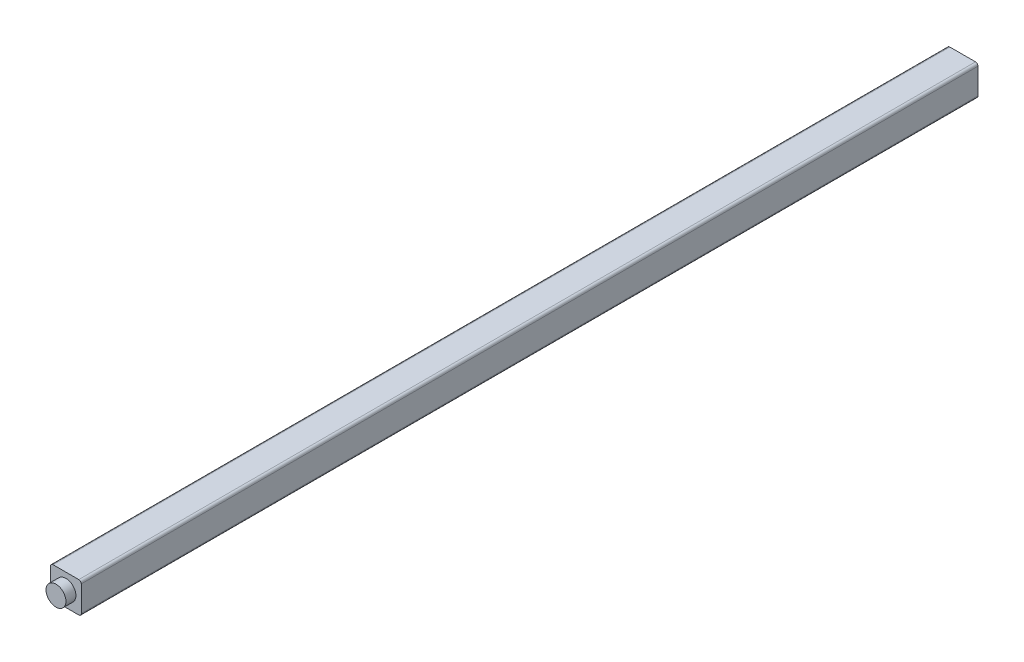
ISO-10303-21;
HEADER;
FILE_DESCRIPTION(('STEP AP214'),'2;1');
FILE_NAME('part.step','',(''),(''),'','','');
FILE_SCHEMA(('AUTOMOTIVE_DESIGN { 1 0 10303 214 1 1 1 1 }'));
ENDSEC;
DATA;
#1=APPLICATION_CONTEXT('core data for automotive mechanical design processes');
#2=APPLICATION_PROTOCOL_DEFINITION('international standard','automotive_design',2000,#1);
#3=PRODUCT_CONTEXT('',#1,'mechanical');
#4=PRODUCT('Part','Part','',(#3));
#5=PRODUCT_RELATED_PRODUCT_CATEGORY('part','',(#4));
#6=PRODUCT_DEFINITION_FORMATION('','',#4);
#7=PRODUCT_DEFINITION_CONTEXT('part definition',#1,'design');
#8=PRODUCT_DEFINITION('design','',#6,#7);
#9=PRODUCT_DEFINITION_SHAPE('','',#8);
#10=(LENGTH_UNIT() NAMED_UNIT(*) SI_UNIT(.MILLI.,.METRE.));
#11=(NAMED_UNIT(*) PLANE_ANGLE_UNIT() SI_UNIT($,.RADIAN.));
#12=(NAMED_UNIT(*) SI_UNIT($,.STERADIAN.) SOLID_ANGLE_UNIT());
#13=UNCERTAINTY_MEASURE_WITH_UNIT(LENGTH_MEASURE(1.E-05),#10,'distance_accuracy_value','');
#14=(GEOMETRIC_REPRESENTATION_CONTEXT(3) GLOBAL_UNCERTAINTY_ASSIGNED_CONTEXT((#13)) GLOBAL_UNIT_ASSIGNED_CONTEXT((#10,
#11,#12)) REPRESENTATION_CONTEXT('',''));
#15=CARTESIAN_POINT('',(0.,0.,0.));
#16=DIRECTION('',(0.,0.,1.));
#17=DIRECTION('',(1.,0.,0.));
#18=AXIS2_PLACEMENT_3D('',#15,#16,#17);
#19=CARTESIAN_POINT('',(2.83000000000011,0.250000000000028,90.));
#20=DIRECTION('',(0.,0.,0.999999999999999));
#21=DIRECTION('',(1.,0.,0.));
#22=AXIS2_PLACEMENT_3D('',#19,#20,#21);
#23=PLANE('',#22);
#24=CARTESIAN_POINT('',(2.83000000000011,0.250000000000028,90.));
#25=DIRECTION('',(0.,0.,0.999999999999999));
#26=DIRECTION('',(1.,0.,0.));
#27=AXIS2_PLACEMENT_3D('',#24,#25,#26);
#28=CIRCLE('',#27,0.25);
#29=CARTESIAN_POINT('',(2.83000000000011,0.,90.));
#30=VERTEX_POINT('',#29);
#31=CARTESIAN_POINT('',(3.08000000000008,0.25,90.));
#32=VERTEX_POINT('',#31);
#33=EDGE_CURVE('E194',#30,#32,#28,.T.);
#34=ORIENTED_EDGE('',*,*,#33,.T.);
#35=DIRECTION('',(0.,1.,0.));
#36=VECTOR('',#35,1.);
#37=CARTESIAN_POINT('',(3.08000000000008,0.25,90.));
#38=LINE('',#37,#36);
#39=CARTESIAN_POINT('',(3.08000000000014,2.83000000000033,90.));
#40=VERTEX_POINT('',#39);
#41=EDGE_CURVE('E128',#32,#40,#38,.T.);
#42=ORIENTED_EDGE('',*,*,#41,.T.);
#43=CARTESIAN_POINT('',(2.83000000000011,2.83000000000014,90.));
#44=DIRECTION('',(0.,0.,0.999999999999999));
#45=DIRECTION('',(-1.,0.,0.));
#46=AXIS2_PLACEMENT_3D('',#43,#44,#45);
#47=CIRCLE('',#46,0.25);
#48=CARTESIAN_POINT('',(2.83000000000011,3.08000000000025,90.));
#49=VERTEX_POINT('',#48);
#50=EDGE_CURVE('E215',#40,#49,#47,.T.);
#51=ORIENTED_EDGE('',*,*,#50,.T.);
#52=DIRECTION('',(-1.,0.,0.));
#53=VECTOR('',#52,1.);
#54=CARTESIAN_POINT('',(0.250000000000083,3.08,90.));
#55=LINE('',#54,#53);
#56=CARTESIAN_POINT('',(0.250000000000083,3.08,90.));
#57=VERTEX_POINT('',#56);
#58=EDGE_CURVE('E228',#49,#57,#55,.T.);
#59=ORIENTED_EDGE('',*,*,#58,.T.);
#60=CARTESIAN_POINT('',(0.250000000000083,2.82999999999994,90.));
#61=DIRECTION('',(0.,0.,0.999999999999999));
#62=DIRECTION('',(1.,0.,0.));
#63=AXIS2_PLACEMENT_3D('',#60,#61,#62);
#64=CIRCLE('',#63,0.25);
#65=CARTESIAN_POINT('',(0.,2.83000000000003,90.));
#66=VERTEX_POINT('',#65);
#67=EDGE_CURVE('E149',#57,#66,#64,.T.);
#68=ORIENTED_EDGE('',*,*,#67,.T.);
#69=DIRECTION('',(0.,-1.,0.));
#70=VECTOR('',#69,1.);
#71=CARTESIAN_POINT('',(1.11022302462516E-13,0.250000000000028,90.));
#72=LINE('',#71,#70);
#73=CARTESIAN_POINT('',(1.11022302462516E-13,0.250000000000028,90.));
#74=VERTEX_POINT('',#73);
#75=EDGE_CURVE('E143',#66,#74,#72,.T.);
#76=ORIENTED_EDGE('',*,*,#75,.T.);
#77=CARTESIAN_POINT('',(0.249999999999972,0.250000000000028,90.));
#78=DIRECTION('',(0.,0.,0.999999999999999));
#79=DIRECTION('',(1.,0.,0.));
#80=AXIS2_PLACEMENT_3D('',#77,#78,#79);
#81=CIRCLE('',#80,0.25);
#82=CARTESIAN_POINT('',(0.250000000000195,0.,90.));
#83=VERTEX_POINT('',#82);
#84=EDGE_CURVE('E147',#74,#83,#81,.T.);
#85=ORIENTED_EDGE('',*,*,#84,.T.);
#86=DIRECTION('',(1.,0.,0.));
#87=VECTOR('',#86,1.);
#88=CARTESIAN_POINT('',(0.250000000000195,0.,90.));
#89=LINE('',#88,#87);
#90=EDGE_CURVE('E74',#83,#30,#89,.T.);
#91=ORIENTED_EDGE('',*,*,#90,.T.);
#92=EDGE_LOOP('',(#34,#42,#51,#59,#68,#76,#85,#91));
#93=FACE_BOUND('',#92,.T.);
#94=CARTESIAN_POINT('',(1.5400000000001,1.53999999999999,90.));
#95=DIRECTION('',(0.,0.,0.999999999999999));
#96=DIRECTION('',(1.,0.,0.));
#97=AXIS2_PLACEMENT_3D('',#94,#95,#96);
#98=CIRCLE('',#97,1.);
#99=CARTESIAN_POINT('',(0.540000000000096,1.53999999999999,90.));
#100=VERTEX_POINT('',#99);
#101=EDGE_CURVE('E240',#100,#100,#98,.T.);
#102=ORIENTED_EDGE('',*,*,#101,.F.);
#103=EDGE_LOOP('',(#102));
#104=FACE_BOUND('',#103,.T.);
#105=ADVANCED_FACE('F53',(#93,#104),#23,.T.);
#106=CARTESIAN_POINT('',(2.83000000000011,0.250000000000028,90.));
#107=DIRECTION('',(0.,0.,-0.999999999999999));
#108=DIRECTION('',(-1.,0.,0.));
#109=AXIS2_PLACEMENT_3D('',#106,#107,#108);
#110=CYLINDRICAL_SURFACE('',#109,0.25);
#111=CARTESIAN_POINT('',(2.83,0.249999999999972,0.));
#112=DIRECTION('',(0.,0.,0.999999999999999));
#113=DIRECTION('',(1.,0.,0.));
#114=AXIS2_PLACEMENT_3D('',#111,#112,#113);
#115=CIRCLE('',#114,0.25);
#116=CARTESIAN_POINT('',(2.83000000000022,0.,0.));
#117=VERTEX_POINT('',#116);
#118=CARTESIAN_POINT('',(3.08000000000019,0.249999999999972,0.));
#119=VERTEX_POINT('',#118);
#120=EDGE_CURVE('E172',#117,#119,#115,.T.);
#121=ORIENTED_EDGE('',*,*,#120,.T.);
#122=DIRECTION('',(0.,0.,-0.999999999999999));
#123=VECTOR('',#122,1.);
#124=CARTESIAN_POINT('',(3.08000000000008,0.25,90.));
#125=LINE('',#124,#123);
#126=EDGE_CURVE('E13',#32,#119,#125,.T.);
#127=ORIENTED_EDGE('',*,*,#126,.F.);
#128=ORIENTED_EDGE('',*,*,#33,.F.);
#129=DIRECTION('',(0.,0.,-0.999999999999999));
#130=VECTOR('',#129,1.);
#131=CARTESIAN_POINT('',(2.83000000000011,0.,90.));
#132=LINE('',#131,#130);
#133=EDGE_CURVE('E168',#30,#117,#132,.T.);
#134=ORIENTED_EDGE('',*,*,#133,.T.);
#135=EDGE_LOOP('',(#121,#127,#128,#134));
#136=FACE_BOUND('',#135,.T.);
#137=ADVANCED_FACE('F55',(#136),#110,.T.);
#138=CARTESIAN_POINT('',(3.08000000000008,0.25,90.));
#139=DIRECTION('',(-1.,0.,0.));
#140=DIRECTION('',(0.,0.,0.999999999999999));
#141=AXIS2_PLACEMENT_3D('',#138,#139,#140);
#142=PLANE('',#141);
#143=DIRECTION('',(0.,1.,0.));
#144=VECTOR('',#143,1.);
#145=CARTESIAN_POINT('',(3.08000000000019,0.249999999999972,0.));
#146=LINE('',#145,#144);
#147=CARTESIAN_POINT('',(3.08000000000008,2.83000000000028,0.));
#148=VERTEX_POINT('',#147);
#149=EDGE_CURVE('E176',#119,#148,#146,.T.);
#150=ORIENTED_EDGE('',*,*,#149,.T.);
#151=DIRECTION('',(0.,0.,-0.999999999999999));
#152=VECTOR('',#151,1.);
#153=CARTESIAN_POINT('',(3.08000000000014,2.83000000000033,90.));
#154=LINE('',#153,#152);
#155=EDGE_CURVE('E63',#40,#148,#154,.T.);
#156=ORIENTED_EDGE('',*,*,#155,.F.);
#157=ORIENTED_EDGE('',*,*,#41,.F.);
#158=ORIENTED_EDGE('',*,*,#126,.T.);
#159=EDGE_LOOP('',(#150,#156,#157,#158));
#160=FACE_BOUND('',#159,.T.);
#161=ADVANCED_FACE('F258',(#160),#142,.F.);
#162=CARTESIAN_POINT('',(2.83000000000011,2.83000000000014,90.));
#163=DIRECTION('',(0.,0.,-0.999999999999999));
#164=DIRECTION('',(-1.,0.,0.));
#165=AXIS2_PLACEMENT_3D('',#162,#163,#164);
#166=CYLINDRICAL_SURFACE('',#165,0.25);
#167=CARTESIAN_POINT('',(2.83000000000011,2.83000000000011,0.));
#168=DIRECTION('',(0.,0.,0.999999999999999));
#169=DIRECTION('',(-1.,0.,0.));
#170=AXIS2_PLACEMENT_3D('',#167,#168,#169);
#171=CIRCLE('',#170,0.25);
#172=CARTESIAN_POINT('',(2.83000000000005,3.08000000000025,0.));
#173=VERTEX_POINT('',#172);
#174=EDGE_CURVE('E180',#148,#173,#171,.T.);
#175=ORIENTED_EDGE('',*,*,#174,.T.);
#176=DIRECTION('',(0.,0.,-0.999999999999999));
#177=VECTOR('',#176,1.);
#178=CARTESIAN_POINT('',(2.83000000000011,3.08000000000025,90.));
#179=LINE('',#178,#177);
#180=EDGE_CURVE('E205',#49,#173,#179,.T.);
#181=ORIENTED_EDGE('',*,*,#180,.F.);
#182=ORIENTED_EDGE('',*,*,#50,.F.);
#183=ORIENTED_EDGE('',*,*,#155,.T.);
#184=EDGE_LOOP('',(#175,#181,#182,#183));
#185=FACE_BOUND('',#184,.T.);
#186=ADVANCED_FACE('F213',(#185),#166,.T.);
#187=CARTESIAN_POINT('',(0.250000000000083,3.08,90.));
#188=DIRECTION('',(0.,-1.,0.));
#189=DIRECTION('',(0.,0.,-0.999999999999999));
#190=AXIS2_PLACEMENT_3D('',#187,#188,#189);
#191=PLANE('',#190);
#192=DIRECTION('',(-1.,0.,0.));
#193=VECTOR('',#192,1.);
#194=CARTESIAN_POINT('',(0.249999999999972,3.07999999999997,0.));
#195=LINE('',#194,#193);
#196=CARTESIAN_POINT('',(0.249999999999972,3.07999999999997,0.));
#197=VERTEX_POINT('',#196);
#198=EDGE_CURVE('E183',#173,#197,#195,.T.);
#199=ORIENTED_EDGE('',*,*,#198,.T.);
#200=DIRECTION('',(0.,0.,-0.999999999999999));
#201=VECTOR('',#200,1.);
#202=CARTESIAN_POINT('',(0.250000000000083,3.08,90.));
#203=LINE('',#202,#201);
#204=EDGE_CURVE('E201',#57,#197,#203,.T.);
#205=ORIENTED_EDGE('',*,*,#204,.F.);
#206=ORIENTED_EDGE('',*,*,#58,.F.);
#207=ORIENTED_EDGE('',*,*,#180,.T.);
#208=EDGE_LOOP('',(#199,#205,#206,#207));
#209=FACE_BOUND('',#208,.T.);
#210=ADVANCED_FACE('F223',(#209),#191,.F.);
#211=CARTESIAN_POINT('',(0.250000000000083,2.82999999999994,90.));
#212=DIRECTION('',(0.,0.,-0.999999999999999));
#213=DIRECTION('',(-1.,0.,0.));
#214=AXIS2_PLACEMENT_3D('',#211,#212,#213);
#215=CYLINDRICAL_SURFACE('',#214,0.25);
#216=CARTESIAN_POINT('',(0.250000000000083,2.82999999999989,0.));
#217=DIRECTION('',(0.,0.,0.999999999999999));
#218=DIRECTION('',(1.,0.,0.));
#219=AXIS2_PLACEMENT_3D('',#216,#217,#218);
#220=CIRCLE('',#219,0.25);
#221=CARTESIAN_POINT('',(0.,2.83000000000003,0.));
#222=VERTEX_POINT('',#221);
#223=EDGE_CURVE('E186',#197,#222,#220,.T.);
#224=ORIENTED_EDGE('',*,*,#223,.T.);
#225=DIRECTION('',(0.,0.,-0.999999999999999));
#226=VECTOR('',#225,1.);
#227=CARTESIAN_POINT('',(0.,2.83000000000003,90.));
#228=LINE('',#227,#226);
#229=EDGE_CURVE('E160',#66,#222,#228,.T.);
#230=ORIENTED_EDGE('',*,*,#229,.F.);
#231=ORIENTED_EDGE('',*,*,#67,.F.);
#232=ORIENTED_EDGE('',*,*,#204,.T.);
#233=EDGE_LOOP('',(#224,#230,#231,#232));
#234=FACE_BOUND('',#233,.T.);
#235=ADVANCED_FACE('F226',(#234),#215,.T.);
#236=CARTESIAN_POINT('',(1.11022302462516E-13,0.250000000000028,90.));
#237=DIRECTION('',(1.,0.,0.));
#238=DIRECTION('',(0.,0.,-0.999999999999999));
#239=AXIS2_PLACEMENT_3D('',#236,#237,#238);
#240=PLANE('',#239);
#241=DIRECTION('',(0.,-1.,0.));
#242=VECTOR('',#241,1.);
#243=CARTESIAN_POINT('',(1.11022302462516E-13,0.250000000000083,0.));
#244=LINE('',#243,#242);
#245=CARTESIAN_POINT('',(1.11022302462516E-13,0.250000000000083,0.));
#246=VERTEX_POINT('',#245);
#247=EDGE_CURVE('E158',#222,#246,#244,.T.);
#248=ORIENTED_EDGE('',*,*,#247,.T.);
#249=DIRECTION('',(0.,0.,-0.999999999999999));
#250=VECTOR('',#249,1.);
#251=CARTESIAN_POINT('',(1.11022302462516E-13,0.250000000000028,90.));
#252=LINE('',#251,#250);
#253=EDGE_CURVE('E155',#74,#246,#252,.T.);
#254=ORIENTED_EDGE('',*,*,#253,.F.);
#255=ORIENTED_EDGE('',*,*,#75,.F.);
#256=ORIENTED_EDGE('',*,*,#229,.T.);
#257=EDGE_LOOP('',(#248,#254,#255,#256));
#258=FACE_BOUND('',#257,.T.);
#259=ADVANCED_FACE('F156',(#258),#240,.F.);
#260=CARTESIAN_POINT('',(0.249999999999972,0.250000000000028,90.));
#261=DIRECTION('',(0.,0.,-0.999999999999999));
#262=DIRECTION('',(-1.,0.,0.));
#263=AXIS2_PLACEMENT_3D('',#260,#261,#262);
#264=CYLINDRICAL_SURFACE('',#263,0.25);
#265=CARTESIAN_POINT('',(0.249999999999972,0.249999999999972,0.));
#266=DIRECTION('',(0.,0.,0.999999999999999));
#267=DIRECTION('',(1.,0.,0.));
#268=AXIS2_PLACEMENT_3D('',#265,#266,#267);
#269=CIRCLE('',#268,0.25);
#270=CARTESIAN_POINT('',(0.250000000000083,0.,0.));
#271=VERTEX_POINT('',#270);
#272=EDGE_CURVE('E110',#246,#271,#269,.T.);
#273=ORIENTED_EDGE('',*,*,#272,.T.);
#274=DIRECTION('',(0.,0.,-0.999999999999999));
#275=VECTOR('',#274,1.);
#276=CARTESIAN_POINT('',(0.250000000000195,0.,90.));
#277=LINE('',#276,#275);
#278=EDGE_CURVE('E161',#83,#271,#277,.T.);
#279=ORIENTED_EDGE('',*,*,#278,.F.);
#280=ORIENTED_EDGE('',*,*,#84,.F.);
#281=ORIENTED_EDGE('',*,*,#253,.T.);
#282=EDGE_LOOP('',(#273,#279,#280,#281));
#283=FACE_BOUND('',#282,.T.);
#284=ADVANCED_FACE('F163',(#283),#264,.T.);
#285=CARTESIAN_POINT('',(0.250000000000195,0.,90.));
#286=DIRECTION('',(0.,1.,0.));
#287=DIRECTION('',(0.,0.,0.999999999999999));
#288=AXIS2_PLACEMENT_3D('',#285,#286,#287);
#289=PLANE('',#288);
#290=DIRECTION('',(1.,0.,0.));
#291=VECTOR('',#290,1.);
#292=CARTESIAN_POINT('',(0.250000000000083,0.,0.));
#293=LINE('',#292,#291);
#294=EDGE_CURVE('E118',#271,#117,#293,.T.);
#295=ORIENTED_EDGE('',*,*,#294,.T.);
#296=ORIENTED_EDGE('',*,*,#133,.F.);
#297=ORIENTED_EDGE('',*,*,#90,.F.);
#298=ORIENTED_EDGE('',*,*,#278,.T.);
#299=EDGE_LOOP('',(#295,#296,#297,#298));
#300=FACE_BOUND('',#299,.T.);
#301=ADVANCED_FACE('F264',(#300),#289,.F.);
#302=CARTESIAN_POINT('',(2.83,0.249999999999972,0.));
#303=DIRECTION('',(0.,0.,0.999999999999999));
#304=DIRECTION('',(1.,0.,0.));
#305=AXIS2_PLACEMENT_3D('',#302,#303,#304);
#306=PLANE('',#305);
#307=ORIENTED_EDGE('',*,*,#120,.F.);
#308=ORIENTED_EDGE('',*,*,#294,.F.);
#309=ORIENTED_EDGE('',*,*,#272,.F.);
#310=ORIENTED_EDGE('',*,*,#247,.F.);
#311=ORIENTED_EDGE('',*,*,#223,.F.);
#312=ORIENTED_EDGE('',*,*,#198,.F.);
#313=ORIENTED_EDGE('',*,*,#174,.F.);
#314=ORIENTED_EDGE('',*,*,#149,.F.);
#315=EDGE_LOOP('',(#307,#308,#309,#310,#311,#312,#313,#314));
#316=FACE_BOUND('',#315,.T.);
#317=ADVANCED_FACE('F219',(#316),#306,.F.);
#318=CARTESIAN_POINT('',(1.5400000000001,1.53999999999999,91.));
#319=DIRECTION('',(0.,0.,-0.999999999999999));
#320=DIRECTION('',(-1.,0.,0.));
#321=AXIS2_PLACEMENT_3D('',#318,#319,#320);
#322=CYLINDRICAL_SURFACE('',#321,1.);
#323=CARTESIAN_POINT('',(1.5400000000001,1.53999999999999,91.));
#324=DIRECTION('',(0.,0.,0.999999999999999));
#325=DIRECTION('',(1.,0.,0.));
#326=AXIS2_PLACEMENT_3D('',#323,#324,#325);
#327=CIRCLE('',#326,1.);
#328=CARTESIAN_POINT('',(0.540000000000096,1.53999999999999,91.));
#329=VERTEX_POINT('',#328);
#330=EDGE_CURVE('E177',#329,#329,#327,.T.);
#331=CARTESIAN_POINT('',(0.540000000000096,1.53999999999999,91.));
#332=CARTESIAN_POINT('',(0.540000000000096,1.53999999999999,90.9895833333333));
#333=CARTESIAN_POINT('',(0.540000000000096,1.53999999999999,90.9791666666666));
#334=CARTESIAN_POINT('',(0.540000000000096,1.53999999999999,90.9583333333333));
#335=CARTESIAN_POINT('',(0.540000000000096,1.53999999999999,90.9479166666666));
#336=CARTESIAN_POINT('',(0.540000000000096,1.53999999999999,90.9270833333333));
#337=CARTESIAN_POINT('',(0.540000000000096,1.53999999999999,90.9166666666666));
#338=CARTESIAN_POINT('',(0.540000000000096,1.53999999999999,90.8958333333333));
#339=CARTESIAN_POINT('',(0.540000000000096,1.53999999999999,90.8854166666666));
#340=CARTESIAN_POINT('',(0.540000000000096,1.53999999999999,90.8645833333333));
#341=CARTESIAN_POINT('',(0.540000000000096,1.53999999999999,90.8541666666666));
#342=CARTESIAN_POINT('',(0.540000000000096,1.53999999999999,90.8333333333333));
#343=CARTESIAN_POINT('',(0.540000000000096,1.53999999999999,90.8229166666666));
#344=CARTESIAN_POINT('',(0.540000000000096,1.53999999999999,90.8020833333333));
#345=CARTESIAN_POINT('',(0.540000000000096,1.53999999999999,90.7916666666666));
#346=CARTESIAN_POINT('',(0.540000000000096,1.53999999999999,90.7708333333333));
#347=CARTESIAN_POINT('',(0.540000000000096,1.53999999999999,90.7604166666666));
#348=CARTESIAN_POINT('',(0.540000000000096,1.53999999999999,90.7395833333333));
#349=CARTESIAN_POINT('',(0.540000000000096,1.53999999999999,90.7291666666666));
#350=CARTESIAN_POINT('',(0.540000000000096,1.53999999999999,90.7083333333333));
#351=CARTESIAN_POINT('',(0.540000000000096,1.53999999999999,90.6979166666666));
#352=CARTESIAN_POINT('',(0.540000000000096,1.53999999999999,90.6770833333333));
#353=CARTESIAN_POINT('',(0.540000000000096,1.53999999999999,90.6666666666666));
#354=CARTESIAN_POINT('',(0.540000000000096,1.53999999999999,90.6458333333333));
#355=CARTESIAN_POINT('',(0.540000000000096,1.53999999999999,90.6354166666666));
#356=CARTESIAN_POINT('',(0.540000000000096,1.53999999999999,90.6145833333333));
#357=CARTESIAN_POINT('',(0.540000000000096,1.53999999999999,90.6041666666666));
#358=CARTESIAN_POINT('',(0.540000000000096,1.53999999999999,90.5833333333333));
#359=CARTESIAN_POINT('',(0.540000000000096,1.53999999999999,90.5729166666666));
#360=CARTESIAN_POINT('',(0.540000000000096,1.53999999999999,90.5520833333333));
#361=CARTESIAN_POINT('',(0.540000000000096,1.53999999999999,90.5416666666666));
#362=CARTESIAN_POINT('',(0.540000000000096,1.53999999999999,90.5208333333333));
#363=CARTESIAN_POINT('',(0.540000000000096,1.53999999999999,90.5104166666666));
#364=CARTESIAN_POINT('',(0.540000000000096,1.53999999999999,90.4895833333333));
#365=CARTESIAN_POINT('',(0.540000000000096,1.53999999999999,90.4791666666666));
#366=CARTESIAN_POINT('',(0.540000000000096,1.53999999999999,90.4583333333333));
#367=CARTESIAN_POINT('',(0.540000000000096,1.53999999999999,90.4479166666666));
#368=CARTESIAN_POINT('',(0.540000000000096,1.53999999999999,90.4270833333333));
#369=CARTESIAN_POINT('',(0.540000000000096,1.53999999999999,90.4166666666666));
#370=CARTESIAN_POINT('',(0.540000000000096,1.53999999999999,90.3958333333333));
#371=CARTESIAN_POINT('',(0.540000000000096,1.53999999999999,90.3854166666666));
#372=CARTESIAN_POINT('',(0.540000000000096,1.53999999999999,90.3645833333333));
#373=CARTESIAN_POINT('',(0.540000000000096,1.53999999999999,90.3541666666666));
#374=CARTESIAN_POINT('',(0.540000000000096,1.53999999999999,90.3333333333333));
#375=CARTESIAN_POINT('',(0.540000000000096,1.53999999999999,90.3229166666666));
#376=CARTESIAN_POINT('',(0.540000000000096,1.53999999999999,90.3020833333333));
#377=CARTESIAN_POINT('',(0.540000000000096,1.53999999999999,90.2916666666666));
#378=CARTESIAN_POINT('',(0.540000000000096,1.53999999999999,90.2708333333333));
#379=CARTESIAN_POINT('',(0.540000000000096,1.53999999999999,90.2604166666666));
#380=CARTESIAN_POINT('',(0.540000000000096,1.53999999999999,90.2395833333333));
#381=CARTESIAN_POINT('',(0.540000000000096,1.53999999999999,90.2291666666666));
#382=CARTESIAN_POINT('',(0.540000000000096,1.53999999999999,90.2083333333333));
#383=CARTESIAN_POINT('',(0.540000000000096,1.53999999999999,90.1979166666666));
#384=CARTESIAN_POINT('',(0.540000000000096,1.53999999999999,90.1770833333333));
#385=CARTESIAN_POINT('',(0.540000000000096,1.53999999999999,90.1666666666666));
#386=CARTESIAN_POINT('',(0.540000000000096,1.53999999999999,90.1458333333333));
#387=CARTESIAN_POINT('',(0.540000000000096,1.53999999999999,90.1354166666666));
#388=CARTESIAN_POINT('',(0.540000000000096,1.53999999999999,90.1145833333333));
#389=CARTESIAN_POINT('',(0.540000000000096,1.53999999999999,90.1041666666666));
#390=CARTESIAN_POINT('',(0.540000000000096,1.53999999999999,90.0833333333333));
#391=CARTESIAN_POINT('',(0.540000000000096,1.53999999999999,90.0729166666666));
#392=CARTESIAN_POINT('',(0.540000000000096,1.53999999999999,90.0520833333333));
#393=CARTESIAN_POINT('',(0.540000000000096,1.53999999999999,90.0416666666666));
#394=CARTESIAN_POINT('',(0.540000000000096,1.53999999999999,90.0208333333333));
#395=CARTESIAN_POINT('',(0.540000000000096,1.53999999999999,90.0104166666666));
#396=CARTESIAN_POINT('',(0.540000000000096,1.53999999999999,90.));
#397=B_SPLINE_CURVE_WITH_KNOTS('',3,(#331,#332,#333,#334,#335,#336,#337,#338,#339,#340,#341,
#342,#343,#344,#345,#346,#347,#348,#349,#350,#351,#352,#353,#354,#355,#356,#357,#358,#359,#360,
#361,#362,#363,#364,#365,#366,#367,#368,#369,#370,#371,#372,#373,#374,#375,#376,#377,#378,#379,
#380,#381,#382,#383,#384,#385,#386,#387,#388,#389,#390,#391,#392,#393,#394,#395,#396),
.UNSPECIFIED.,.F.,.F.,(4,2,2,2,2,2,2,2,2,2,2,2,2,2,2,2,2,2,2,2,2,2,2,2,2,2,2,2,2,2,2,2,4),(0.,
0.0312500000000104,0.062500000000007,0.0937500000000036,0.125000000000014,0.156250000000011,
0.187500000000007,0.218750000000004,0.25,0.281250000000011,0.312500000000007,0.343750000000004,
0.375000000000014,0.406250000000011,0.437500000000007,0.468750000000004,0.5,0.531250000000011,
0.562500000000007,0.593750000000004,0.625000000000014,0.656250000000011,0.687500000000008,
0.718750000000004,0.750000000000001,0.781250000000011,0.812500000000008,0.843750000000004,
0.875000000000015,0.906250000000011,0.937500000000008,0.968750000000004,1.),.UNSPECIFIED.);
#398=EDGE_CURVE('BSEAM248',#329,#100,#397,.T.);
#399=ORIENTED_EDGE('',*,*,#330,.F.);
#400=ORIENTED_EDGE('',*,*,#101,.T.);
#401=ORIENTED_EDGE('',*,*,#398,.T.);
#402=ORIENTED_EDGE('',*,*,#398,.F.);
#403=EDGE_LOOP('',(#399,#401,#400,#402));
#404=FACE_BOUND('',#403,.T.);
#405=ADVANCED_FACE('F248',(#404),#322,.T.);
#406=CARTESIAN_POINT('',(1.5400000000001,1.53999999999999,91.));
#407=DIRECTION('',(0.,0.,0.999999999999999));
#408=DIRECTION('',(1.,0.,0.));
#409=AXIS2_PLACEMENT_3D('',#406,#407,#408);
#410=PLANE('',#409);
#411=ORIENTED_EDGE('',*,*,#330,.T.);
#412=EDGE_LOOP('',(#411));
#413=FACE_BOUND('',#412,.T.);
#414=ADVANCED_FACE('F246',(#413),#410,.T.);
#415=CLOSED_SHELL('',(#105,#137,#161,#186,#210,#235,#259,#284,#301,#317,#405,#414));
#416=MANIFOLD_SOLID_BREP('B2',#415);
#417=ADVANCED_BREP_SHAPE_REPRESENTATION('',(#18,#416),#14);
#418=SHAPE_DEFINITION_REPRESENTATION(#9,#417);
ENDSEC;
END-ISO-10303-21;
